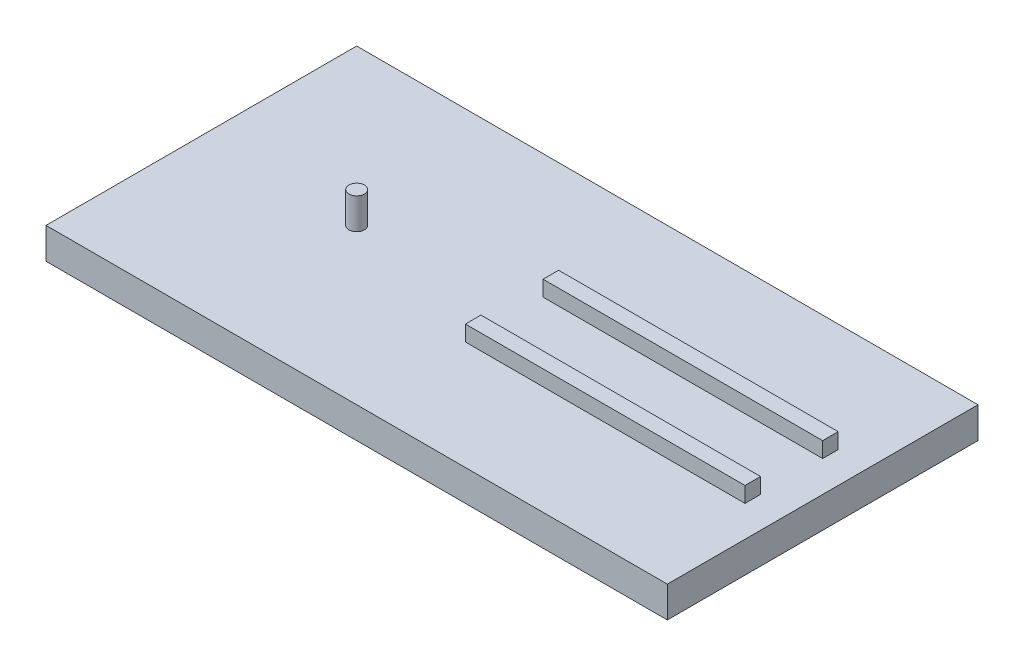
ISO-10303-21;
HEADER;
FILE_DESCRIPTION(('STEP AP214'),'2;1');
FILE_NAME('part.step','',(''),(''),'','','');
FILE_SCHEMA(('AUTOMOTIVE_DESIGN { 1 0 10303 214 1 1 1 1 }'));
ENDSEC;
DATA;
#1=APPLICATION_CONTEXT('core data for automotive mechanical design processes');
#2=APPLICATION_PROTOCOL_DEFINITION('international standard','automotive_design',2000,#1);
#3=PRODUCT_CONTEXT('',#1,'mechanical');
#4=PRODUCT('Part','Part','',(#3));
#5=PRODUCT_RELATED_PRODUCT_CATEGORY('part','',(#4));
#6=PRODUCT_DEFINITION_FORMATION('','',#4);
#7=PRODUCT_DEFINITION_CONTEXT('part definition',#1,'design');
#8=PRODUCT_DEFINITION('design','',#6,#7);
#9=PRODUCT_DEFINITION_SHAPE('','',#8);
#10=(LENGTH_UNIT() NAMED_UNIT(*) SI_UNIT(.MILLI.,.METRE.));
#11=(NAMED_UNIT(*) PLANE_ANGLE_UNIT() SI_UNIT($,.RADIAN.));
#12=(NAMED_UNIT(*) SI_UNIT($,.STERADIAN.) SOLID_ANGLE_UNIT());
#13=UNCERTAINTY_MEASURE_WITH_UNIT(LENGTH_MEASURE(1.E-05),#10,'distance_accuracy_value','');
#14=(GEOMETRIC_REPRESENTATION_CONTEXT(3) GLOBAL_UNCERTAINTY_ASSIGNED_CONTEXT((#13)) GLOBAL_UNIT_ASSIGNED_CONTEXT((#10,
#11,#12)) REPRESENTATION_CONTEXT('',''));
#15=CARTESIAN_POINT('',(0.,0.,0.));
#16=DIRECTION('',(0.,0.,1.));
#17=DIRECTION('',(1.,0.,0.));
#18=AXIS2_PLACEMENT_3D('',#15,#16,#17);
#19=CARTESIAN_POINT('',(0.,10.,0.));
#20=DIRECTION('',(0.,-1.,0.));
#21=DIRECTION('',(0.,0.,-1.));
#22=AXIS2_PLACEMENT_3D('',#19,#20,#21);
#23=PLANE('',#22);
#24=CARTESIAN_POINT('',(-50.,10.,0.));
#25=DIRECTION('',(0.,-1.,0.));
#26=DIRECTION('',(0.,0.,-1.));
#27=AXIS2_PLACEMENT_3D('',#24,#25,#26);
#28=CIRCLE('',#27,2.5);
#29=CARTESIAN_POINT('',(-50.,10.,-2.5));
#30=VERTEX_POINT('',#29);
#31=EDGE_CURVE('E11',#30,#30,#28,.F.);
#32=ORIENTED_EDGE('',*,*,#31,.F.);
#33=EDGE_LOOP('',(#32));
#34=FACE_BOUND('',#33,.T.);
#35=DIRECTION('',(0.,0.,-1.));
#36=VECTOR('',#35,1.);
#37=CARTESIAN_POINT('',(100.,10.,50.));
#38=LINE('',#37,#36);
#39=CARTESIAN_POINT('',(100.,10.,50.));
#40=VERTEX_POINT('',#39);
#41=CARTESIAN_POINT('',(100.,10.,-50.));
#42=VERTEX_POINT('',#41);
#43=EDGE_CURVE('E185',#40,#42,#38,.T.);
#44=ORIENTED_EDGE('',*,*,#43,.T.);
#45=DIRECTION('',(-1.,0.,0.));
#46=VECTOR('',#45,1.);
#47=CARTESIAN_POINT('',(-100.,10.,-50.));
#48=LINE('',#47,#46);
#49=CARTESIAN_POINT('',(-100.,10.,-50.));
#50=VERTEX_POINT('',#49);
#51=EDGE_CURVE('E188',#42,#50,#48,.T.);
#52=ORIENTED_EDGE('',*,*,#51,.T.);
#53=DIRECTION('',(0.,0.,1.));
#54=VECTOR('',#53,1.);
#55=CARTESIAN_POINT('',(-100.,10.,50.));
#56=LINE('',#55,#54);
#57=CARTESIAN_POINT('',(-100.,10.,50.));
#58=VERTEX_POINT('',#57);
#59=EDGE_CURVE('E191',#50,#58,#56,.T.);
#60=ORIENTED_EDGE('',*,*,#59,.T.);
#61=DIRECTION('',(1.,0.,0.));
#62=VECTOR('',#61,1.);
#63=CARTESIAN_POINT('',(-100.,10.,50.));
#64=LINE('',#63,#62);
#65=EDGE_CURVE('E193',#58,#40,#64,.T.);
#66=ORIENTED_EDGE('',*,*,#65,.T.);
#67=EDGE_LOOP('',(#44,#52,#60,#66));
#68=FACE_BOUND('',#67,.T.);
#69=DIRECTION('',(1.,0.,0.));
#70=VECTOR('',#69,1.);
#71=CARTESIAN_POINT('',(0.,10.,15.));
#72=LINE('',#71,#70);
#73=CARTESIAN_POINT('',(0.,10.,15.));
#74=VERTEX_POINT('',#73);
#75=CARTESIAN_POINT('',(90.,10.,15.));
#76=VERTEX_POINT('',#75);
#77=EDGE_CURVE('E165',#74,#76,#72,.T.);
#78=ORIENTED_EDGE('',*,*,#77,.F.);
#79=DIRECTION('',(0.,0.,-1.));
#80=VECTOR('',#79,1.);
#81=CARTESIAN_POINT('',(0.,10.,15.));
#82=LINE('',#81,#80);
#83=CARTESIAN_POINT('',(0.,10.,10.));
#84=VERTEX_POINT('',#83);
#85=EDGE_CURVE('E146',#74,#84,#82,.T.);
#86=ORIENTED_EDGE('',*,*,#85,.T.);
#87=DIRECTION('',(1.,0.,0.));
#88=VECTOR('',#87,1.);
#89=CARTESIAN_POINT('',(0.,10.,10.));
#90=LINE('',#89,#88);
#91=CARTESIAN_POINT('',(90.,10.,10.));
#92=VERTEX_POINT('',#91);
#93=EDGE_CURVE('E149',#84,#92,#90,.T.);
#94=ORIENTED_EDGE('',*,*,#93,.T.);
#95=DIRECTION('',(0.,0.,-1.));
#96=VECTOR('',#95,1.);
#97=CARTESIAN_POINT('',(90.,10.,15.));
#98=LINE('',#97,#96);
#99=EDGE_CURVE('E56',#76,#92,#98,.T.);
#100=ORIENTED_EDGE('',*,*,#99,.F.);
#101=EDGE_LOOP('',(#78,#86,#94,#100));
#102=FACE_BOUND('',#101,.T.);
#103=DIRECTION('',(0.,0.,1.));
#104=VECTOR('',#103,1.);
#105=CARTESIAN_POINT('',(0.,10.,-15.));
#106=LINE('',#105,#104);
#107=CARTESIAN_POINT('',(0.,10.,-15.));
#108=VERTEX_POINT('',#107);
#109=CARTESIAN_POINT('',(0.,10.,-9.99999999999999));
#110=VERTEX_POINT('',#109);
#111=EDGE_CURVE('E129',#108,#110,#106,.T.);
#112=ORIENTED_EDGE('',*,*,#111,.F.);
#113=DIRECTION('',(1.,0.,0.));
#114=VECTOR('',#113,1.);
#115=CARTESIAN_POINT('',(0.,10.,-15.));
#116=LINE('',#115,#114);
#117=CARTESIAN_POINT('',(90.,10.,-15.));
#118=VERTEX_POINT('',#117);
#119=EDGE_CURVE('E140',#108,#118,#116,.T.);
#120=ORIENTED_EDGE('',*,*,#119,.T.);
#121=DIRECTION('',(0.,0.,1.));
#122=VECTOR('',#121,1.);
#123=CARTESIAN_POINT('',(90.,10.,-15.));
#124=LINE('',#123,#122);
#125=CARTESIAN_POINT('',(90.,10.,-9.99999999999999));
#126=VERTEX_POINT('',#125);
#127=EDGE_CURVE('E48',#118,#126,#124,.T.);
#128=ORIENTED_EDGE('',*,*,#127,.T.);
#129=DIRECTION('',(1.,0.,0.));
#130=VECTOR('',#129,1.);
#131=CARTESIAN_POINT('',(0.,10.,-9.99999999999999));
#132=LINE('',#131,#130);
#133=EDGE_CURVE('E145',#110,#126,#132,.T.);
#134=ORIENTED_EDGE('',*,*,#133,.F.);
#135=EDGE_LOOP('',(#112,#120,#128,#134));
#136=FACE_BOUND('',#135,.T.);
#137=ADVANCED_FACE('F33',(#34,#68,#102,#136),#23,.F.);
#138=CARTESIAN_POINT('',(100.,10.,50.));
#139=DIRECTION('',(-1.,0.,0.));
#140=DIRECTION('',(0.,0.,1.));
#141=AXIS2_PLACEMENT_3D('',#138,#139,#140);
#142=PLANE('',#141);
#143=DIRECTION('',(0.,0.,-1.));
#144=VECTOR('',#143,1.);
#145=CARTESIAN_POINT('',(100.,0.,50.));
#146=LINE('',#145,#144);
#147=CARTESIAN_POINT('',(100.,0.,50.));
#148=VERTEX_POINT('',#147);
#149=CARTESIAN_POINT('',(100.,0.,-50.));
#150=VERTEX_POINT('',#149);
#151=EDGE_CURVE('E179',#148,#150,#146,.T.);
#152=ORIENTED_EDGE('',*,*,#151,.T.);
#153=DIRECTION('',(0.,-1.,0.));
#154=VECTOR('',#153,1.);
#155=CARTESIAN_POINT('',(100.,10.,-50.));
#156=LINE('',#155,#154);
#157=EDGE_CURVE('E41',#42,#150,#156,.T.);
#158=ORIENTED_EDGE('',*,*,#157,.F.);
#159=ORIENTED_EDGE('',*,*,#43,.F.);
#160=DIRECTION('',(0.,-1.,0.));
#161=VECTOR('',#160,1.);
#162=CARTESIAN_POINT('',(100.,10.,50.));
#163=LINE('',#162,#161);
#164=EDGE_CURVE('E195',#40,#148,#163,.T.);
#165=ORIENTED_EDGE('',*,*,#164,.T.);
#166=EDGE_LOOP('',(#152,#158,#159,#165));
#167=FACE_BOUND('',#166,.T.);
#168=ADVANCED_FACE('F35',(#167),#142,.F.);
#169=CARTESIAN_POINT('',(-100.,10.,-50.));
#170=DIRECTION('',(0.,0.,1.));
#171=DIRECTION('',(1.,0.,0.));
#172=AXIS2_PLACEMENT_3D('',#169,#170,#171);
#173=PLANE('',#172);
#174=DIRECTION('',(-1.,0.,0.));
#175=VECTOR('',#174,1.);
#176=CARTESIAN_POINT('',(-100.,0.,-50.));
#177=LINE('',#176,#175);
#178=CARTESIAN_POINT('',(-100.,0.,-50.));
#179=VERTEX_POINT('',#178);
#180=EDGE_CURVE('E198',#150,#179,#177,.T.);
#181=ORIENTED_EDGE('',*,*,#180,.T.);
#182=DIRECTION('',(0.,-1.,0.));
#183=VECTOR('',#182,1.);
#184=CARTESIAN_POINT('',(-100.,10.,-50.));
#185=LINE('',#184,#183);
#186=EDGE_CURVE('E208',#50,#179,#185,.T.);
#187=ORIENTED_EDGE('',*,*,#186,.F.);
#188=ORIENTED_EDGE('',*,*,#51,.F.);
#189=ORIENTED_EDGE('',*,*,#157,.T.);
#190=EDGE_LOOP('',(#181,#187,#188,#189));
#191=FACE_BOUND('',#190,.T.);
#192=ADVANCED_FACE('F213',(#191),#173,.F.);
#193=CARTESIAN_POINT('',(-100.,10.,50.));
#194=DIRECTION('',(1.,0.,0.));
#195=DIRECTION('',(0.,0.,-1.));
#196=AXIS2_PLACEMENT_3D('',#193,#194,#195);
#197=PLANE('',#196);
#198=DIRECTION('',(0.,0.,1.));
#199=VECTOR('',#198,1.);
#200=CARTESIAN_POINT('',(-100.,0.,50.));
#201=LINE('',#200,#199);
#202=CARTESIAN_POINT('',(-100.,0.,50.));
#203=VERTEX_POINT('',#202);
#204=EDGE_CURVE('E200',#179,#203,#201,.T.);
#205=ORIENTED_EDGE('',*,*,#204,.T.);
#206=DIRECTION('',(0.,-1.,0.));
#207=VECTOR('',#206,1.);
#208=CARTESIAN_POINT('',(-100.,10.,50.));
#209=LINE('',#208,#207);
#210=EDGE_CURVE('E205',#58,#203,#209,.T.);
#211=ORIENTED_EDGE('',*,*,#210,.F.);
#212=ORIENTED_EDGE('',*,*,#59,.F.);
#213=ORIENTED_EDGE('',*,*,#186,.T.);
#214=EDGE_LOOP('',(#205,#211,#212,#213));
#215=FACE_BOUND('',#214,.T.);
#216=ADVANCED_FACE('F225',(#215),#197,.F.);
#217=CARTESIAN_POINT('',(-100.,10.,50.));
#218=DIRECTION('',(0.,0.,-1.));
#219=DIRECTION('',(-1.,0.,0.));
#220=AXIS2_PLACEMENT_3D('',#217,#218,#219);
#221=PLANE('',#220);
#222=DIRECTION('',(1.,0.,0.));
#223=VECTOR('',#222,1.);
#224=CARTESIAN_POINT('',(-100.,0.,50.));
#225=LINE('',#224,#223);
#226=EDGE_CURVE('E189',#203,#148,#225,.T.);
#227=ORIENTED_EDGE('',*,*,#226,.T.);
#228=ORIENTED_EDGE('',*,*,#164,.F.);
#229=ORIENTED_EDGE('',*,*,#65,.F.);
#230=ORIENTED_EDGE('',*,*,#210,.T.);
#231=EDGE_LOOP('',(#227,#228,#229,#230));
#232=FACE_BOUND('',#231,.T.);
#233=ADVANCED_FACE('F229',(#232),#221,.F.);
#234=CARTESIAN_POINT('',(0.,0.,0.));
#235=DIRECTION('',(0.,-1.,0.));
#236=DIRECTION('',(0.,0.,-1.));
#237=AXIS2_PLACEMENT_3D('',#234,#235,#236);
#238=PLANE('',#237);
#239=ORIENTED_EDGE('',*,*,#151,.F.);
#240=ORIENTED_EDGE('',*,*,#226,.F.);
#241=ORIENTED_EDGE('',*,*,#204,.F.);
#242=ORIENTED_EDGE('',*,*,#180,.F.);
#243=EDGE_LOOP('',(#239,#240,#241,#242));
#244=FACE_BOUND('',#243,.T.);
#245=ADVANCED_FACE('F221',(#244),#238,.T.);
#246=CARTESIAN_POINT('',(0.,15.,15.));
#247=DIRECTION('',(-1.,0.,0.));
#248=DIRECTION('',(0.,0.,1.));
#249=AXIS2_PLACEMENT_3D('',#246,#247,#248);
#250=PLANE('',#249);
#251=ORIENTED_EDGE('',*,*,#85,.F.);
#252=DIRECTION('',(0.,-1.,0.));
#253=VECTOR('',#252,1.);
#254=CARTESIAN_POINT('',(0.,15.,15.));
#255=LINE('',#254,#253);
#256=CARTESIAN_POINT('',(0.,15.,15.));
#257=VERTEX_POINT('',#256);
#258=EDGE_CURVE('E177',#257,#74,#255,.T.);
#259=ORIENTED_EDGE('',*,*,#258,.F.);
#260=DIRECTION('',(0.,0.,-1.));
#261=VECTOR('',#260,1.);
#262=CARTESIAN_POINT('',(0.,15.,15.));
#263=LINE('',#262,#261);
#264=CARTESIAN_POINT('',(0.,15.,10.));
#265=VERTEX_POINT('',#264);
#266=EDGE_CURVE('E161',#257,#265,#263,.T.);
#267=ORIENTED_EDGE('',*,*,#266,.T.);
#268=DIRECTION('',(0.,-1.,0.));
#269=VECTOR('',#268,1.);
#270=CARTESIAN_POINT('',(0.,15.,10.));
#271=LINE('',#270,#269);
#272=EDGE_CURVE('E171',#265,#84,#271,.T.);
#273=ORIENTED_EDGE('',*,*,#272,.T.);
#274=EDGE_LOOP('',(#251,#259,#267,#273));
#275=FACE_BOUND('',#274,.T.);
#276=ADVANCED_FACE('F248',(#275),#250,.T.);
#277=CARTESIAN_POINT('',(0.,15.,15.));
#278=DIRECTION('',(0.,0.,-1.));
#279=DIRECTION('',(-1.,0.,0.));
#280=AXIS2_PLACEMENT_3D('',#277,#278,#279);
#281=PLANE('',#280);
#282=ORIENTED_EDGE('',*,*,#77,.T.);
#283=DIRECTION('',(0.,-1.,0.));
#284=VECTOR('',#283,1.);
#285=CARTESIAN_POINT('',(90.,15.,15.));
#286=LINE('',#285,#284);
#287=CARTESIAN_POINT('',(90.,15.,15.));
#288=VERTEX_POINT('',#287);
#289=EDGE_CURVE('E180',#288,#76,#286,.T.);
#290=ORIENTED_EDGE('',*,*,#289,.F.);
#291=DIRECTION('',(1.,0.,0.));
#292=VECTOR('',#291,1.);
#293=CARTESIAN_POINT('',(0.,15.,15.));
#294=LINE('',#293,#292);
#295=EDGE_CURVE('E170',#257,#288,#294,.T.);
#296=ORIENTED_EDGE('',*,*,#295,.F.);
#297=ORIENTED_EDGE('',*,*,#258,.T.);
#298=EDGE_LOOP('',(#282,#290,#296,#297));
#299=FACE_BOUND('',#298,.T.);
#300=ADVANCED_FACE('F239',(#299),#281,.F.);
#301=CARTESIAN_POINT('',(90.,15.,15.));
#302=DIRECTION('',(-1.,0.,0.));
#303=DIRECTION('',(0.,0.,1.));
#304=AXIS2_PLACEMENT_3D('',#301,#302,#303);
#305=PLANE('',#304);
#306=ORIENTED_EDGE('',*,*,#99,.T.);
#307=DIRECTION('',(0.,-1.,0.));
#308=VECTOR('',#307,1.);
#309=CARTESIAN_POINT('',(90.,15.,10.));
#310=LINE('',#309,#308);
#311=CARTESIAN_POINT('',(90.,15.,10.));
#312=VERTEX_POINT('',#311);
#313=EDGE_CURVE('E182',#312,#92,#310,.T.);
#314=ORIENTED_EDGE('',*,*,#313,.F.);
#315=DIRECTION('',(0.,0.,-1.));
#316=VECTOR('',#315,1.);
#317=CARTESIAN_POINT('',(90.,15.,15.));
#318=LINE('',#317,#316);
#319=EDGE_CURVE('E168',#288,#312,#318,.T.);
#320=ORIENTED_EDGE('',*,*,#319,.F.);
#321=ORIENTED_EDGE('',*,*,#289,.T.);
#322=EDGE_LOOP('',(#306,#314,#320,#321));
#323=FACE_BOUND('',#322,.T.);
#324=ADVANCED_FACE('F242',(#323),#305,.F.);
#325=CARTESIAN_POINT('',(0.,15.,10.));
#326=DIRECTION('',(0.,0.,-1.));
#327=DIRECTION('',(-1.,0.,0.));
#328=AXIS2_PLACEMENT_3D('',#325,#326,#327);
#329=PLANE('',#328);
#330=ORIENTED_EDGE('',*,*,#93,.F.);
#331=ORIENTED_EDGE('',*,*,#272,.F.);
#332=DIRECTION('',(1.,0.,0.));
#333=VECTOR('',#332,1.);
#334=CARTESIAN_POINT('',(0.,15.,10.));
#335=LINE('',#334,#333);
#336=EDGE_CURVE('E164',#265,#312,#335,.T.);
#337=ORIENTED_EDGE('',*,*,#336,.T.);
#338=ORIENTED_EDGE('',*,*,#313,.T.);
#339=EDGE_LOOP('',(#330,#331,#337,#338));
#340=FACE_BOUND('',#339,.T.);
#341=ADVANCED_FACE('F251',(#340),#329,.T.);
#342=CARTESIAN_POINT('',(0.,15.,0.));
#343=DIRECTION('',(0.,-1.,0.));
#344=DIRECTION('',(0.,0.,-1.));
#345=AXIS2_PLACEMENT_3D('',#342,#343,#344);
#346=PLANE('',#345);
#347=ORIENTED_EDGE('',*,*,#266,.F.);
#348=ORIENTED_EDGE('',*,*,#295,.T.);
#349=ORIENTED_EDGE('',*,*,#319,.T.);
#350=ORIENTED_EDGE('',*,*,#336,.F.);
#351=EDGE_LOOP('',(#347,#348,#349,#350));
#352=FACE_BOUND('',#351,.T.);
#353=ADVANCED_FACE('F246',(#352),#346,.F.);
#354=CARTESIAN_POINT('',(0.,15.,-15.));
#355=DIRECTION('',(1.,0.,0.));
#356=DIRECTION('',(0.,0.,-1.));
#357=AXIS2_PLACEMENT_3D('',#354,#355,#356);
#358=PLANE('',#357);
#359=ORIENTED_EDGE('',*,*,#111,.T.);
#360=DIRECTION('',(0.,-1.,0.));
#361=VECTOR('',#360,1.);
#362=CARTESIAN_POINT('',(0.,15.,-9.99999999999999));
#363=LINE('',#362,#361);
#364=CARTESIAN_POINT('',(0.,15.,-9.99999999999999));
#365=VERTEX_POINT('',#364);
#366=EDGE_CURVE('E404',#365,#110,#363,.T.);
#367=ORIENTED_EDGE('',*,*,#366,.F.);
#368=DIRECTION('',(0.,0.,1.));
#369=VECTOR('',#368,1.);
#370=CARTESIAN_POINT('',(0.,15.,-15.));
#371=LINE('',#370,#369);
#372=CARTESIAN_POINT('',(0.,15.,-15.));
#373=VERTEX_POINT('',#372);
#374=EDGE_CURVE('E132',#373,#365,#371,.T.);
#375=ORIENTED_EDGE('',*,*,#374,.F.);
#376=DIRECTION('',(0.,-1.,0.));
#377=VECTOR('',#376,1.);
#378=CARTESIAN_POINT('',(0.,15.,-15.));
#379=LINE('',#378,#377);
#380=EDGE_CURVE('E124',#373,#108,#379,.T.);
#381=ORIENTED_EDGE('',*,*,#380,.T.);
#382=EDGE_LOOP('',(#359,#367,#375,#381));
#383=FACE_BOUND('',#382,.T.);
#384=ADVANCED_FACE('F126',(#383),#358,.F.);
#385=CARTESIAN_POINT('',(0.,15.,-9.99999999999999));
#386=DIRECTION('',(0.,0.,-1.));
#387=DIRECTION('',(-1.,0.,0.));
#388=AXIS2_PLACEMENT_3D('',#385,#386,#387);
#389=PLANE('',#388);
#390=ORIENTED_EDGE('',*,*,#133,.T.);
#391=DIRECTION('',(0.,-1.,0.));
#392=VECTOR('',#391,1.);
#393=CARTESIAN_POINT('',(90.,15.,-9.99999999999999));
#394=LINE('',#393,#392);
#395=CARTESIAN_POINT('',(90.,15.,-9.99999999999999));
#396=VERTEX_POINT('',#395);
#397=EDGE_CURVE('E405',#396,#126,#394,.T.);
#398=ORIENTED_EDGE('',*,*,#397,.F.);
#399=DIRECTION('',(1.,0.,0.));
#400=VECTOR('',#399,1.);
#401=CARTESIAN_POINT('',(0.,15.,-9.99999999999999));
#402=LINE('',#401,#400);
#403=EDGE_CURVE('E158',#365,#396,#402,.T.);
#404=ORIENTED_EDGE('',*,*,#403,.F.);
#405=ORIENTED_EDGE('',*,*,#366,.T.);
#406=EDGE_LOOP('',(#390,#398,#404,#405));
#407=FACE_BOUND('',#406,.T.);
#408=ADVANCED_FACE('F315',(#407),#389,.F.);
#409=CARTESIAN_POINT('',(90.,15.,-15.));
#410=DIRECTION('',(1.,0.,0.));
#411=DIRECTION('',(0.,0.,-1.));
#412=AXIS2_PLACEMENT_3D('',#409,#410,#411);
#413=PLANE('',#412);
#414=ORIENTED_EDGE('',*,*,#127,.F.);
#415=DIRECTION('',(0.,-1.,0.));
#416=VECTOR('',#415,1.);
#417=CARTESIAN_POINT('',(90.,15.,-15.));
#418=LINE('',#417,#416);
#419=CARTESIAN_POINT('',(90.,15.,-15.));
#420=VERTEX_POINT('',#419);
#421=EDGE_CURVE('E137',#420,#118,#418,.T.);
#422=ORIENTED_EDGE('',*,*,#421,.F.);
#423=DIRECTION('',(0.,0.,1.));
#424=VECTOR('',#423,1.);
#425=CARTESIAN_POINT('',(90.,15.,-15.));
#426=LINE('',#425,#424);
#427=EDGE_CURVE('E155',#420,#396,#426,.T.);
#428=ORIENTED_EDGE('',*,*,#427,.T.);
#429=ORIENTED_EDGE('',*,*,#397,.T.);
#430=EDGE_LOOP('',(#414,#422,#428,#429));
#431=FACE_BOUND('',#430,.T.);
#432=ADVANCED_FACE('F318',(#431),#413,.T.);
#433=CARTESIAN_POINT('',(0.,15.,-15.));
#434=DIRECTION('',(0.,0.,-1.));
#435=DIRECTION('',(-1.,0.,0.));
#436=AXIS2_PLACEMENT_3D('',#433,#434,#435);
#437=PLANE('',#436);
#438=ORIENTED_EDGE('',*,*,#119,.F.);
#439=ORIENTED_EDGE('',*,*,#380,.F.);
#440=DIRECTION('',(1.,0.,0.));
#441=VECTOR('',#440,1.);
#442=CARTESIAN_POINT('',(0.,15.,-15.));
#443=LINE('',#442,#441);
#444=EDGE_CURVE('E136',#373,#420,#443,.T.);
#445=ORIENTED_EDGE('',*,*,#444,.T.);
#446=ORIENTED_EDGE('',*,*,#421,.T.);
#447=EDGE_LOOP('',(#438,#439,#445,#446));
#448=FACE_BOUND('',#447,.T.);
#449=ADVANCED_FACE('F141',(#448),#437,.T.);
#450=CARTESIAN_POINT('',(0.,15.,0.));
#451=DIRECTION('',(0.,1.,0.));
#452=DIRECTION('',(0.,0.,1.));
#453=AXIS2_PLACEMENT_3D('',#450,#451,#452);
#454=PLANE('',#453);
#455=ORIENTED_EDGE('',*,*,#374,.T.);
#456=ORIENTED_EDGE('',*,*,#403,.T.);
#457=ORIENTED_EDGE('',*,*,#427,.F.);
#458=ORIENTED_EDGE('',*,*,#444,.F.);
#459=EDGE_LOOP('',(#455,#456,#457,#458));
#460=FACE_BOUND('',#459,.T.);
#461=ADVANCED_FACE('F287',(#460),#454,.T.);
#462=CARTESIAN_POINT('',(-50.,20.,0.));
#463=DIRECTION('',(0.,-1.,0.));
#464=DIRECTION('',(0.,0.,-1.));
#465=AXIS2_PLACEMENT_3D('',#462,#463,#464);
#466=CYLINDRICAL_SURFACE('',#465,2.5);
#467=CARTESIAN_POINT('',(-50.,20.,0.));
#468=DIRECTION('',(0.,1.,0.));
#469=DIRECTION('',(0.,0.,1.));
#470=AXIS2_PLACEMENT_3D('',#467,#468,#469);
#471=CIRCLE('',#470,2.5);
#472=CARTESIAN_POINT('',(-50.,20.,2.5));
#473=VERTEX_POINT('',#472);
#474=EDGE_CURVE('E406',#473,#473,#471,.T.);
#475=ORIENTED_EDGE('',*,*,#474,.F.);
#476=EDGE_LOOP('',(#475));
#477=FACE_BOUND('',#476,.T.);
#478=ORIENTED_EDGE('',*,*,#31,.T.);
#479=EDGE_LOOP('',(#478));
#480=FACE_BOUND('',#479,.T.);
#481=ADVANCED_FACE('F292',(#477,#480),#466,.T.);
#482=CARTESIAN_POINT('',(-50.,20.,0.));
#483=DIRECTION('',(0.,1.,0.));
#484=DIRECTION('',(0.,0.,1.));
#485=AXIS2_PLACEMENT_3D('',#482,#483,#484);
#486=PLANE('',#485);
#487=ORIENTED_EDGE('',*,*,#474,.T.);
#488=EDGE_LOOP('',(#487));
#489=FACE_BOUND('',#488,.T.);
#490=ADVANCED_FACE('F297',(#489),#486,.T.);
#491=CLOSED_SHELL('',(#137,#168,#192,#216,#233,#245,#276,#300,#324,#341,#353,#384,#408,#432,
#449,#461,#481,#490));
#492=MANIFOLD_SOLID_BREP('B2',#491);
#493=ADVANCED_BREP_SHAPE_REPRESENTATION('',(#18,#492),#14);
#494=SHAPE_DEFINITION_REPRESENTATION(#9,#493);
ENDSEC;
END-ISO-10303-21;
